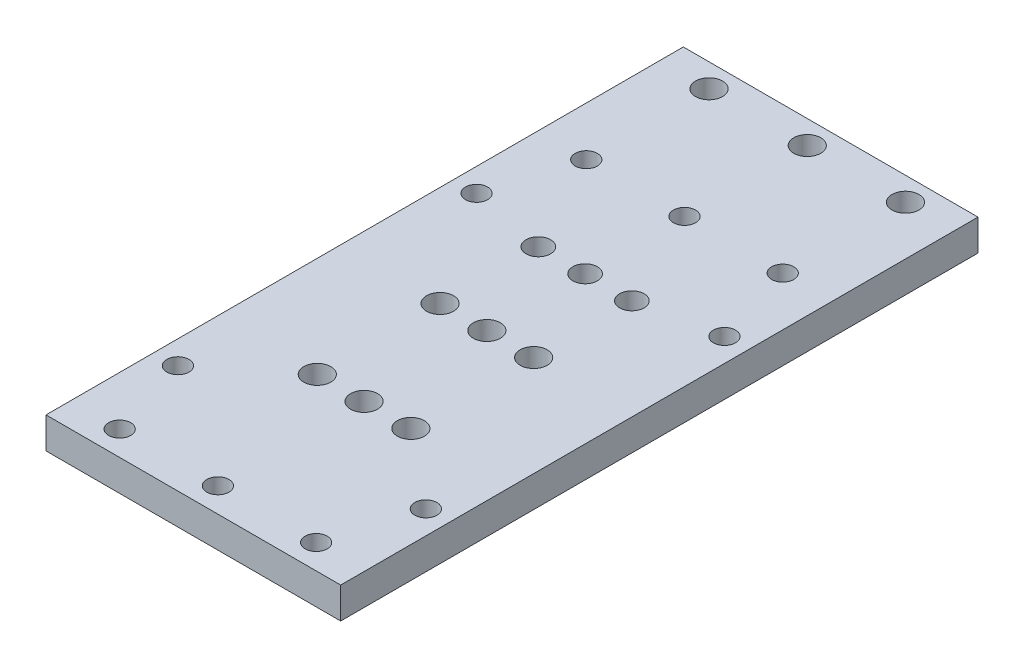
ISO-10303-21;
HEADER;
FILE_DESCRIPTION(('STEP AP214'),'2;1');
FILE_NAME('part.step','',(''),(''),'','','');
FILE_SCHEMA(('AUTOMOTIVE_DESIGN { 1 0 10303 214 1 1 1 1 }'));
ENDSEC;
DATA;
#1=APPLICATION_CONTEXT('core data for automotive mechanical design processes');
#2=APPLICATION_PROTOCOL_DEFINITION('international standard','automotive_design',2000,#1);
#3=PRODUCT_CONTEXT('',#1,'mechanical');
#4=PRODUCT('Part','Part','',(#3));
#5=PRODUCT_RELATED_PRODUCT_CATEGORY('part','',(#4));
#6=PRODUCT_DEFINITION_FORMATION('','',#4);
#7=PRODUCT_DEFINITION_CONTEXT('part definition',#1,'design');
#8=PRODUCT_DEFINITION('design','',#6,#7);
#9=PRODUCT_DEFINITION_SHAPE('','',#8);
#10=(LENGTH_UNIT() NAMED_UNIT(*) SI_UNIT(.MILLI.,.METRE.));
#11=(NAMED_UNIT(*) PLANE_ANGLE_UNIT() SI_UNIT($,.RADIAN.));
#12=(NAMED_UNIT(*) SI_UNIT($,.STERADIAN.) SOLID_ANGLE_UNIT());
#13=UNCERTAINTY_MEASURE_WITH_UNIT(LENGTH_MEASURE(1.E-05),#10,'distance_accuracy_value','');
#14=(GEOMETRIC_REPRESENTATION_CONTEXT(3) GLOBAL_UNCERTAINTY_ASSIGNED_CONTEXT((#13)) GLOBAL_UNIT_ASSIGNED_CONTEXT((#10,
#11,#12)) REPRESENTATION_CONTEXT('',''));
#15=CARTESIAN_POINT('',(0.,0.,0.));
#16=DIRECTION('',(0.,0.,1.));
#17=DIRECTION('',(1.,0.,0.));
#18=AXIS2_PLACEMENT_3D('',#15,#16,#17);
#19=CARTESIAN_POINT('',(30.,3.175,-80.));
#20=DIRECTION('',(-1.,0.,0.));
#21=DIRECTION('',(0.,0.,1.));
#22=AXIS2_PLACEMENT_3D('',#19,#20,#21);
#23=PLANE('',#22);
#24=DIRECTION('',(0.,0.,-1.));
#25=VECTOR('',#24,1.);
#26=CARTESIAN_POINT('',(30.,3.175,-80.));
#27=LINE('',#26,#25);
#28=CARTESIAN_POINT('',(30.,3.175,49.7625));
#29=VERTEX_POINT('',#28);
#30=CARTESIAN_POINT('',(30.,3.175,-80.));
#31=VERTEX_POINT('',#30);
#32=EDGE_CURVE('E85',#29,#31,#27,.T.);
#33=ORIENTED_EDGE('',*,*,#32,.F.);
#34=DIRECTION('',(0.,1.,0.));
#35=VECTOR('',#34,1.);
#36=CARTESIAN_POINT('',(30.,-70.3635883632779,49.7625));
#37=LINE('',#36,#35);
#38=CARTESIAN_POINT('',(30.,-3.175,49.7625));
#39=VERTEX_POINT('',#38);
#40=EDGE_CURVE('E236',#39,#29,#37,.T.);
#41=ORIENTED_EDGE('',*,*,#40,.F.);
#42=DIRECTION('',(0.,0.,-1.));
#43=VECTOR('',#42,1.);
#44=CARTESIAN_POINT('',(30.,-3.175,-80.));
#45=LINE('',#44,#43);
#46=CARTESIAN_POINT('',(30.,-3.175,-80.));
#47=VERTEX_POINT('',#46);
#48=EDGE_CURVE('E77',#39,#47,#45,.T.);
#49=ORIENTED_EDGE('',*,*,#48,.T.);
#50=DIRECTION('',(0.,-1.,0.));
#51=VECTOR('',#50,1.);
#52=CARTESIAN_POINT('',(30.,3.175,-80.));
#53=LINE('',#52,#51);
#54=EDGE_CURVE('E11',#31,#47,#53,.T.);
#55=ORIENTED_EDGE('',*,*,#54,.F.);
#56=EDGE_LOOP('',(#33,#41,#49,#55));
#57=FACE_BOUND('',#56,.T.);
#58=ADVANCED_FACE('F33',(#57),#23,.F.);
#59=CARTESIAN_POINT('',(-30.,3.175,-80.));
#60=DIRECTION('',(0.,0.,1.));
#61=DIRECTION('',(1.,0.,0.));
#62=AXIS2_PLACEMENT_3D('',#59,#60,#61);
#63=PLANE('',#62);
#64=CARTESIAN_POINT('',(12.,0.,-80.));
#65=DIRECTION('',(0.,0.,-1.));
#66=DIRECTION('',(-1.,0.,0.));
#67=AXIS2_PLACEMENT_3D('',#64,#65,#66);
#68=CIRCLE('',#67,1.5);
#69=CARTESIAN_POINT('',(10.5,0.,-80.));
#70=VERTEX_POINT('',#69);
#71=EDGE_CURVE('E154',#70,#70,#68,.T.);
#72=ORIENTED_EDGE('',*,*,#71,.F.);
#73=EDGE_LOOP('',(#72));
#74=FACE_BOUND('',#73,.T.);
#75=CARTESIAN_POINT('',(-12.,0.,-80.));
#76=DIRECTION('',(0.,0.,-1.));
#77=DIRECTION('',(1.,0.,0.));
#78=AXIS2_PLACEMENT_3D('',#75,#76,#77);
#79=CIRCLE('',#78,1.5);
#80=CARTESIAN_POINT('',(-10.5,0.,-80.));
#81=VERTEX_POINT('',#80);
#82=EDGE_CURVE('E147',#81,#81,#79,.T.);
#83=ORIENTED_EDGE('',*,*,#82,.F.);
#84=EDGE_LOOP('',(#83));
#85=FACE_BOUND('',#84,.T.);
#86=DIRECTION('',(-1.,0.,0.));
#87=VECTOR('',#86,1.);
#88=CARTESIAN_POINT('',(-30.,-3.175,-80.));
#89=LINE('',#88,#87);
#90=CARTESIAN_POINT('',(-30.,-3.175,-80.));
#91=VERTEX_POINT('',#90);
#92=EDGE_CURVE('E68',#47,#91,#89,.T.);
#93=ORIENTED_EDGE('',*,*,#92,.T.);
#94=DIRECTION('',(0.,-1.,0.));
#95=VECTOR('',#94,1.);
#96=CARTESIAN_POINT('',(-30.,3.175,-80.));
#97=LINE('',#96,#95);
#98=CARTESIAN_POINT('',(-30.,3.175,-80.));
#99=VERTEX_POINT('',#98);
#100=EDGE_CURVE('E40',#99,#91,#97,.T.);
#101=ORIENTED_EDGE('',*,*,#100,.F.);
#102=DIRECTION('',(-1.,0.,0.));
#103=VECTOR('',#102,1.);
#104=CARTESIAN_POINT('',(-30.,3.175,-80.));
#105=LINE('',#104,#103);
#106=EDGE_CURVE('E56',#31,#99,#105,.T.);
#107=ORIENTED_EDGE('',*,*,#106,.F.);
#108=ORIENTED_EDGE('',*,*,#54,.T.);
#109=EDGE_LOOP('',(#93,#101,#107,#108));
#110=FACE_BOUND('',#109,.T.);
#111=ADVANCED_FACE('F70',(#74,#85,#110),#63,.F.);
#112=CARTESIAN_POINT('',(-30.,3.175,-80.));
#113=DIRECTION('',(1.,0.,0.));
#114=DIRECTION('',(0.,0.,-1.));
#115=AXIS2_PLACEMENT_3D('',#112,#113,#114);
#116=PLANE('',#115);
#117=DIRECTION('',(0.,0.,1.));
#118=VECTOR('',#117,1.);
#119=CARTESIAN_POINT('',(-30.,-3.175,-80.));
#120=LINE('',#119,#118);
#121=CARTESIAN_POINT('',(-30.,-3.175,49.7625));
#122=VERTEX_POINT('',#121);
#123=EDGE_CURVE('E76',#91,#122,#120,.T.);
#124=ORIENTED_EDGE('',*,*,#123,.T.);
#125=DIRECTION('',(0.,1.,0.));
#126=VECTOR('',#125,1.);
#127=CARTESIAN_POINT('',(-30.,-70.3635883632779,49.7625));
#128=LINE('',#127,#126);
#129=CARTESIAN_POINT('',(-30.,3.175,49.7625));
#130=VERTEX_POINT('',#129);
#131=EDGE_CURVE('E47',#122,#130,#128,.T.);
#132=ORIENTED_EDGE('',*,*,#131,.T.);
#133=DIRECTION('',(0.,0.,1.));
#134=VECTOR('',#133,1.);
#135=CARTESIAN_POINT('',(-30.,3.175,-80.));
#136=LINE('',#135,#134);
#137=EDGE_CURVE('E82',#99,#130,#136,.T.);
#138=ORIENTED_EDGE('',*,*,#137,.F.);
#139=ORIENTED_EDGE('',*,*,#100,.T.);
#140=EDGE_LOOP('',(#124,#132,#138,#139));
#141=FACE_BOUND('',#140,.T.);
#142=ADVANCED_FACE('F81',(#141),#116,.F.);
#143=CARTESIAN_POINT('',(0.,3.175,0.));
#144=DIRECTION('',(0.,1.,0.));
#145=DIRECTION('',(0.,0.,1.));
#146=AXIS2_PLACEMENT_3D('',#143,#144,#145);
#147=PLANE('',#146);
#148=DIRECTION('',(-1.,0.,0.));
#149=VECTOR('',#148,1.);
#150=CARTESIAN_POINT('',(-30.,3.175,49.7625));
#151=LINE('',#150,#149);
#152=EDGE_CURVE('E239',#29,#130,#151,.T.);
#153=ORIENTED_EDGE('',*,*,#152,.F.);
#154=ORIENTED_EDGE('',*,*,#32,.T.);
#155=ORIENTED_EDGE('',*,*,#106,.T.);
#156=ORIENTED_EDGE('',*,*,#137,.T.);
#157=EDGE_LOOP('',(#153,#154,#155,#156));
#158=FACE_BOUND('',#157,.T.);
#159=CARTESIAN_POINT('',(-9.53,3.175,-9.99999999999993));
#160=DIRECTION('',(0.,1.,0.));
#161=DIRECTION('',(0.,0.,1.));
#162=AXIS2_PLACEMENT_3D('',#159,#160,#161);
#163=CIRCLE('',#162,2.75);
#164=CARTESIAN_POINT('',(-9.53,3.175,-7.24999999999993));
#165=VERTEX_POINT('',#164);
#166=EDGE_CURVE('E223',#165,#165,#163,.T.);
#167=ORIENTED_EDGE('',*,*,#166,.F.);
#168=EDGE_LOOP('',(#167));
#169=FACE_BOUND('',#168,.T.);
#170=CARTESIAN_POINT('',(9.53,3.175,15.));
#171=DIRECTION('',(0.,1.,0.));
#172=DIRECTION('',(0.,0.,1.));
#173=AXIS2_PLACEMENT_3D('',#170,#171,#172);
#174=CIRCLE('',#173,2.75);
#175=CARTESIAN_POINT('',(9.53,3.175,17.75));
#176=VERTEX_POINT('',#175);
#177=EDGE_CURVE('E222',#176,#176,#174,.T.);
#178=ORIENTED_EDGE('',*,*,#177,.F.);
#179=EDGE_LOOP('',(#178));
#180=FACE_BOUND('',#179,.T.);
#181=CARTESIAN_POINT('',(9.53,3.175,-10.));
#182=DIRECTION('',(0.,1.,0.));
#183=DIRECTION('',(0.,0.,1.));
#184=AXIS2_PLACEMENT_3D('',#181,#182,#183);
#185=CIRCLE('',#184,2.75);
#186=CARTESIAN_POINT('',(9.53,3.175,-7.25));
#187=VERTEX_POINT('',#186);
#188=EDGE_CURVE('E211',#187,#187,#185,.T.);
#189=ORIENTED_EDGE('',*,*,#188,.F.);
#190=EDGE_LOOP('',(#189));
#191=FACE_BOUND('',#190,.T.);
#192=CARTESIAN_POINT('',(0.,3.175,15.));
#193=DIRECTION('',(0.,1.,0.));
#194=DIRECTION('',(0.,0.,1.));
#195=AXIS2_PLACEMENT_3D('',#192,#193,#194);
#196=CIRCLE('',#195,2.75);
#197=CARTESIAN_POINT('',(0.,3.175,17.75));
#198=VERTEX_POINT('',#197);
#199=EDGE_CURVE('E210',#198,#198,#196,.T.);
#200=ORIENTED_EDGE('',*,*,#199,.F.);
#201=EDGE_LOOP('',(#200));
#202=FACE_BOUND('',#201,.T.);
#203=CARTESIAN_POINT('',(-9.52999999999999,3.175,15.0000000000001));
#204=DIRECTION('',(0.,1.,0.));
#205=DIRECTION('',(0.,0.,1.));
#206=AXIS2_PLACEMENT_3D('',#203,#204,#205);
#207=CIRCLE('',#206,2.75);
#208=CARTESIAN_POINT('',(-9.52999999999999,3.175,17.7500000000001));
#209=VERTEX_POINT('',#208);
#210=EDGE_CURVE('E233',#209,#209,#207,.T.);
#211=ORIENTED_EDGE('',*,*,#210,.F.);
#212=EDGE_LOOP('',(#211));
#213=FACE_BOUND('',#212,.T.);
#214=CARTESIAN_POINT('',(0.,3.175,-10.));
#215=DIRECTION('',(0.,1.,0.));
#216=DIRECTION('',(0.,0.,1.));
#217=AXIS2_PLACEMENT_3D('',#214,#215,#216);
#218=CIRCLE('',#217,2.75);
#219=CARTESIAN_POINT('',(0.,3.175,-7.25));
#220=VERTEX_POINT('',#219);
#221=EDGE_CURVE('E203',#220,#220,#218,.T.);
#222=ORIENTED_EDGE('',*,*,#221,.F.);
#223=EDGE_LOOP('',(#222));
#224=FACE_BOUND('',#223,.T.);
#225=CARTESIAN_POINT('',(-9.53,3.175,-29.9999999999999));
#226=DIRECTION('',(0.,1.,0.));
#227=DIRECTION('',(0.,0.,1.));
#228=AXIS2_PLACEMENT_3D('',#225,#226,#227);
#229=CIRCLE('',#228,2.5);
#230=CARTESIAN_POINT('',(-9.53,3.175,-27.4999999999999));
#231=VERTEX_POINT('',#230);
#232=EDGE_CURVE('E193',#231,#231,#229,.T.);
#233=ORIENTED_EDGE('',*,*,#232,.F.);
#234=EDGE_LOOP('',(#233));
#235=FACE_BOUND('',#234,.T.);
#236=CARTESIAN_POINT('',(9.53,3.175,-30.));
#237=DIRECTION('',(0.,1.,0.));
#238=DIRECTION('',(0.,0.,1.));
#239=AXIS2_PLACEMENT_3D('',#236,#237,#238);
#240=CIRCLE('',#239,2.5);
#241=CARTESIAN_POINT('',(9.53,3.175,-27.5));
#242=VERTEX_POINT('',#241);
#243=EDGE_CURVE('E192',#242,#242,#240,.T.);
#244=ORIENTED_EDGE('',*,*,#243,.F.);
#245=EDGE_LOOP('',(#244));
#246=FACE_BOUND('',#245,.T.);
#247=CARTESIAN_POINT('',(0.,3.175,-30.));
#248=DIRECTION('',(0.,1.,0.));
#249=DIRECTION('',(0.,0.,1.));
#250=AXIS2_PLACEMENT_3D('',#247,#248,#249);
#251=CIRCLE('',#250,2.5);
#252=CARTESIAN_POINT('',(0.,3.175,-27.5));
#253=VERTEX_POINT('',#252);
#254=EDGE_CURVE('E185',#253,#253,#251,.T.);
#255=ORIENTED_EDGE('',*,*,#254,.F.);
#256=EDGE_LOOP('',(#255));
#257=FACE_BOUND('',#256,.T.);
#258=CARTESIAN_POINT('',(-25.2375,3.175,-33.1375));
#259=DIRECTION('',(0.,1.,0.));
#260=DIRECTION('',(0.,0.,-1.));
#261=AXIS2_PLACEMENT_3D('',#258,#259,#260);
#262=CIRCLE('',#261,2.25);
#263=CARTESIAN_POINT('',(-25.2375,3.175,-35.3875));
#264=VERTEX_POINT('',#263);
#265=EDGE_CURVE('E169',#264,#264,#262,.T.);
#266=ORIENTED_EDGE('',*,*,#265,.F.);
#267=EDGE_LOOP('',(#266));
#268=FACE_BOUND('',#267,.T.);
#269=CARTESIAN_POINT('',(25.2375,3.175,-33.1375));
#270=DIRECTION('',(0.,1.,0.));
#271=DIRECTION('',(0.,0.,1.));
#272=AXIS2_PLACEMENT_3D('',#269,#270,#271);
#273=CIRCLE('',#272,2.25);
#274=CARTESIAN_POINT('',(25.2375,3.175,-30.8875));
#275=VERTEX_POINT('',#274);
#276=EDGE_CURVE('E168',#275,#275,#273,.T.);
#277=ORIENTED_EDGE('',*,*,#276,.F.);
#278=EDGE_LOOP('',(#277));
#279=FACE_BOUND('',#278,.T.);
#280=CARTESIAN_POINT('',(25.2375,3.175,27.6625));
#281=DIRECTION('',(0.,1.,0.));
#282=DIRECTION('',(0.,0.,-1.));
#283=AXIS2_PLACEMENT_3D('',#280,#281,#282);
#284=CIRCLE('',#283,2.25);
#285=CARTESIAN_POINT('',(25.2375,3.175,25.4125));
#286=VERTEX_POINT('',#285);
#287=EDGE_CURVE('E176',#286,#286,#284,.T.);
#288=ORIENTED_EDGE('',*,*,#287,.F.);
#289=EDGE_LOOP('',(#288));
#290=FACE_BOUND('',#289,.T.);
#291=CARTESIAN_POINT('',(-25.2375,3.175,27.6625));
#292=DIRECTION('',(0.,1.,0.));
#293=DIRECTION('',(0.,0.,1.));
#294=AXIS2_PLACEMENT_3D('',#291,#292,#293);
#295=CIRCLE('',#294,2.25);
#296=CARTESIAN_POINT('',(-25.2375,3.175,29.9125));
#297=VERTEX_POINT('',#296);
#298=EDGE_CURVE('E161',#297,#297,#295,.T.);
#299=ORIENTED_EDGE('',*,*,#298,.F.);
#300=EDGE_LOOP('',(#299));
#301=FACE_BOUND('',#300,.T.);
#302=CARTESIAN_POINT('',(20.,3.175,-50.2375));
#303=DIRECTION('',(0.,1.,0.));
#304=DIRECTION('',(0.,0.,1.));
#305=AXIS2_PLACEMENT_3D('',#302,#303,#304);
#306=CIRCLE('',#305,2.25);
#307=CARTESIAN_POINT('',(20.,3.175,-47.9875));
#308=VERTEX_POINT('',#307);
#309=EDGE_CURVE('E90',#308,#308,#306,.F.);
#310=ORIENTED_EDGE('',*,*,#309,.T.);
#311=EDGE_LOOP('',(#310));
#312=FACE_BOUND('',#311,.T.);
#313=CARTESIAN_POINT('',(-20.,3.175,-50.2375));
#314=DIRECTION('',(0.,1.,0.));
#315=DIRECTION('',(0.,0.,1.));
#316=AXIS2_PLACEMENT_3D('',#313,#314,#315);
#317=CIRCLE('',#316,2.25);
#318=CARTESIAN_POINT('',(-20.,3.175,-47.9875));
#319=VERTEX_POINT('',#318);
#320=EDGE_CURVE('E95',#319,#319,#317,.F.);
#321=ORIENTED_EDGE('',*,*,#320,.T.);
#322=EDGE_LOOP('',(#321));
#323=FACE_BOUND('',#322,.T.);
#324=CARTESIAN_POINT('',(20.,3.175,-75.2375));
#325=DIRECTION('',(0.,1.,0.));
#326=DIRECTION('',(0.,0.,1.));
#327=AXIS2_PLACEMENT_3D('',#324,#325,#326);
#328=CIRCLE('',#327,2.75);
#329=CARTESIAN_POINT('',(20.,3.175,-72.4875));
#330=VERTEX_POINT('',#329);
#331=EDGE_CURVE('E98',#330,#330,#328,.F.);
#332=ORIENTED_EDGE('',*,*,#331,.T.);
#333=EDGE_LOOP('',(#332));
#334=FACE_BOUND('',#333,.T.);
#335=CARTESIAN_POINT('',(-20.,3.175,-75.2375));
#336=DIRECTION('',(0.,1.,0.));
#337=DIRECTION('',(0.,0.,1.));
#338=AXIS2_PLACEMENT_3D('',#335,#336,#337);
#339=CIRCLE('',#338,2.75);
#340=CARTESIAN_POINT('',(-20.,3.175,-72.4875));
#341=VERTEX_POINT('',#340);
#342=EDGE_CURVE('E101',#341,#341,#339,.F.);
#343=ORIENTED_EDGE('',*,*,#342,.T.);
#344=EDGE_LOOP('',(#343));
#345=FACE_BOUND('',#344,.T.);
#346=CARTESIAN_POINT('',(2.33973929354467E-12,3.175,44.7625));
#347=DIRECTION('',(0.,1.,0.));
#348=DIRECTION('',(0.,0.,1.));
#349=AXIS2_PLACEMENT_3D('',#346,#347,#348);
#350=CIRCLE('',#349,2.25);
#351=CARTESIAN_POINT('',(2.33973929354467E-12,3.175,47.0125));
#352=VERTEX_POINT('',#351);
#353=EDGE_CURVE('E104',#352,#352,#350,.F.);
#354=ORIENTED_EDGE('',*,*,#353,.T.);
#355=EDGE_LOOP('',(#354));
#356=FACE_BOUND('',#355,.T.);
#357=CARTESIAN_POINT('',(-19.9999999999977,3.175,44.7625));
#358=DIRECTION('',(0.,1.,0.));
#359=DIRECTION('',(0.,0.,1.));
#360=AXIS2_PLACEMENT_3D('',#357,#358,#359);
#361=CIRCLE('',#360,2.25);
#362=CARTESIAN_POINT('',(-19.9999999999977,3.175,47.0125));
#363=VERTEX_POINT('',#362);
#364=EDGE_CURVE('E107',#363,#363,#361,.F.);
#365=ORIENTED_EDGE('',*,*,#364,.T.);
#366=EDGE_LOOP('',(#365));
#367=FACE_BOUND('',#366,.T.);
#368=CARTESIAN_POINT('',(20.0000000000023,3.175,44.7625));
#369=DIRECTION('',(0.,1.,0.));
#370=DIRECTION('',(0.,0.,1.));
#371=AXIS2_PLACEMENT_3D('',#368,#369,#370);
#372=CIRCLE('',#371,2.25);
#373=CARTESIAN_POINT('',(20.0000000000023,3.175,47.0125));
#374=VERTEX_POINT('',#373);
#375=EDGE_CURVE('E110',#374,#374,#372,.F.);
#376=ORIENTED_EDGE('',*,*,#375,.T.);
#377=EDGE_LOOP('',(#376));
#378=FACE_BOUND('',#377,.T.);
#379=CARTESIAN_POINT('',(0.,3.175,-50.2375));
#380=DIRECTION('',(0.,1.,0.));
#381=DIRECTION('',(0.,0.,1.));
#382=AXIS2_PLACEMENT_3D('',#379,#380,#381);
#383=CIRCLE('',#382,2.25);
#384=CARTESIAN_POINT('',(0.,3.175,-47.9875));
#385=VERTEX_POINT('',#384);
#386=EDGE_CURVE('E113',#385,#385,#383,.F.);
#387=ORIENTED_EDGE('',*,*,#386,.T.);
#388=EDGE_LOOP('',(#387));
#389=FACE_BOUND('',#388,.T.);
#390=CARTESIAN_POINT('',(0.,3.175,-75.2375));
#391=DIRECTION('',(0.,1.,0.));
#392=DIRECTION('',(0.,0.,1.));
#393=AXIS2_PLACEMENT_3D('',#390,#391,#392);
#394=CIRCLE('',#393,2.75);
#395=CARTESIAN_POINT('',(0.,3.175,-72.4875));
#396=VERTEX_POINT('',#395);
#397=EDGE_CURVE('E116',#396,#396,#394,.F.);
#398=ORIENTED_EDGE('',*,*,#397,.T.);
#399=EDGE_LOOP('',(#398));
#400=FACE_BOUND('',#399,.T.);
#401=ADVANCED_FACE('F250',(#158,#169,#180,#191,#202,#213,#224,#235,#246,#257,#268,#279,#290,
#301,#312,#323,#334,#345,#356,#367,#378,#389,#400),#147,.T.);
#402=CARTESIAN_POINT('',(0.,-3.175,0.));
#403=DIRECTION('',(0.,1.,0.));
#404=DIRECTION('',(0.,0.,1.));
#405=AXIS2_PLACEMENT_3D('',#402,#403,#404);
#406=PLANE('',#405);
#407=CARTESIAN_POINT('',(-9.53,-3.175,-9.99999999999993));
#408=DIRECTION('',(0.,1.,0.));
#409=DIRECTION('',(0.,0.,1.));
#410=AXIS2_PLACEMENT_3D('',#407,#408,#409);
#411=CIRCLE('',#410,2.75);
#412=CARTESIAN_POINT('',(-9.53,-3.175,-7.24999999999993));
#413=VERTEX_POINT('',#412);
#414=EDGE_CURVE('E219',#413,#413,#411,.F.);
#415=ORIENTED_EDGE('',*,*,#414,.F.);
#416=EDGE_LOOP('',(#415));
#417=FACE_BOUND('',#416,.T.);
#418=CARTESIAN_POINT('',(9.53,-3.175,15.));
#419=DIRECTION('',(0.,1.,0.));
#420=DIRECTION('',(0.,0.,1.));
#421=AXIS2_PLACEMENT_3D('',#418,#419,#420);
#422=CIRCLE('',#421,2.75);
#423=CARTESIAN_POINT('',(9.53,-3.175,17.75));
#424=VERTEX_POINT('',#423);
#425=EDGE_CURVE('E214',#424,#424,#422,.F.);
#426=ORIENTED_EDGE('',*,*,#425,.F.);
#427=EDGE_LOOP('',(#426));
#428=FACE_BOUND('',#427,.T.);
#429=CARTESIAN_POINT('',(9.53,-3.175,-10.));
#430=DIRECTION('',(0.,1.,0.));
#431=DIRECTION('',(0.,0.,1.));
#432=AXIS2_PLACEMENT_3D('',#429,#430,#431);
#433=CIRCLE('',#432,2.75);
#434=CARTESIAN_POINT('',(9.53,-3.175,-7.25));
#435=VERTEX_POINT('',#434);
#436=EDGE_CURVE('E207',#435,#435,#433,.F.);
#437=ORIENTED_EDGE('',*,*,#436,.F.);
#438=EDGE_LOOP('',(#437));
#439=FACE_BOUND('',#438,.T.);
#440=CARTESIAN_POINT('',(0.,-3.175,15.));
#441=DIRECTION('',(0.,1.,0.));
#442=DIRECTION('',(0.,0.,1.));
#443=AXIS2_PLACEMENT_3D('',#440,#441,#442);
#444=CIRCLE('',#443,2.75);
#445=CARTESIAN_POINT('',(0.,-3.175,17.75));
#446=VERTEX_POINT('',#445);
#447=EDGE_CURVE('E206',#446,#446,#444,.F.);
#448=ORIENTED_EDGE('',*,*,#447,.F.);
#449=EDGE_LOOP('',(#448));
#450=FACE_BOUND('',#449,.T.);
#451=CARTESIAN_POINT('',(-9.52999999999999,-3.175,15.0000000000001));
#452=DIRECTION('',(0.,1.,0.));
#453=DIRECTION('',(0.,0.,1.));
#454=AXIS2_PLACEMENT_3D('',#451,#452,#453);
#455=CIRCLE('',#454,2.75);
#456=CARTESIAN_POINT('',(-9.52999999999999,-3.175,17.7500000000001));
#457=VERTEX_POINT('',#456);
#458=EDGE_CURVE('E226',#457,#457,#455,.F.);
#459=ORIENTED_EDGE('',*,*,#458,.F.);
#460=EDGE_LOOP('',(#459));
#461=FACE_BOUND('',#460,.T.);
#462=CARTESIAN_POINT('',(0.,-3.175,-10.));
#463=DIRECTION('',(0.,1.,0.));
#464=DIRECTION('',(0.,0.,1.));
#465=AXIS2_PLACEMENT_3D('',#462,#463,#464);
#466=CIRCLE('',#465,2.75);
#467=CARTESIAN_POINT('',(0.,-3.175,-7.25));
#468=VERTEX_POINT('',#467);
#469=EDGE_CURVE('E196',#468,#468,#466,.F.);
#470=ORIENTED_EDGE('',*,*,#469,.F.);
#471=EDGE_LOOP('',(#470));
#472=FACE_BOUND('',#471,.T.);
#473=CARTESIAN_POINT('',(-9.53,-3.175,-29.9999999999999));
#474=DIRECTION('',(0.,1.,0.));
#475=DIRECTION('',(0.,0.,1.));
#476=AXIS2_PLACEMENT_3D('',#473,#474,#475);
#477=CIRCLE('',#476,2.5);
#478=CARTESIAN_POINT('',(-9.53,-3.175,-27.4999999999999));
#479=VERTEX_POINT('',#478);
#480=EDGE_CURVE('E189',#479,#479,#477,.F.);
#481=ORIENTED_EDGE('',*,*,#480,.F.);
#482=EDGE_LOOP('',(#481));
#483=FACE_BOUND('',#482,.T.);
#484=CARTESIAN_POINT('',(9.53,-3.175,-30.));
#485=DIRECTION('',(0.,1.,0.));
#486=DIRECTION('',(0.,0.,1.));
#487=AXIS2_PLACEMENT_3D('',#484,#485,#486);
#488=CIRCLE('',#487,2.5);
#489=CARTESIAN_POINT('',(9.53,-3.175,-27.5));
#490=VERTEX_POINT('',#489);
#491=EDGE_CURVE('E188',#490,#490,#488,.F.);
#492=ORIENTED_EDGE('',*,*,#491,.F.);
#493=EDGE_LOOP('',(#492));
#494=FACE_BOUND('',#493,.T.);
#495=CARTESIAN_POINT('',(0.,-3.175,-30.));
#496=DIRECTION('',(0.,1.,0.));
#497=DIRECTION('',(0.,0.,1.));
#498=AXIS2_PLACEMENT_3D('',#495,#496,#497);
#499=CIRCLE('',#498,2.5);
#500=CARTESIAN_POINT('',(0.,-3.175,-27.5));
#501=VERTEX_POINT('',#500);
#502=EDGE_CURVE('E172',#501,#501,#499,.F.);
#503=ORIENTED_EDGE('',*,*,#502,.F.);
#504=EDGE_LOOP('',(#503));
#505=FACE_BOUND('',#504,.T.);
#506=CARTESIAN_POINT('',(-25.2375,-3.175,-33.1375));
#507=DIRECTION('',(0.,1.,0.));
#508=DIRECTION('',(0.,0.,1.));
#509=AXIS2_PLACEMENT_3D('',#506,#507,#508);
#510=CIRCLE('',#509,2.25);
#511=CARTESIAN_POINT('',(-25.2375,-3.175,-30.8875));
#512=VERTEX_POINT('',#511);
#513=EDGE_CURVE('E165',#512,#512,#510,.F.);
#514=ORIENTED_EDGE('',*,*,#513,.F.);
#515=EDGE_LOOP('',(#514));
#516=FACE_BOUND('',#515,.T.);
#517=CARTESIAN_POINT('',(25.2375,-3.175,-33.1375));
#518=DIRECTION('',(0.,1.,0.));
#519=DIRECTION('',(0.,0.,1.));
#520=AXIS2_PLACEMENT_3D('',#517,#518,#519);
#521=CIRCLE('',#520,2.25);
#522=CARTESIAN_POINT('',(25.2375,-3.175,-30.8875));
#523=VERTEX_POINT('',#522);
#524=EDGE_CURVE('E173',#523,#523,#521,.F.);
#525=ORIENTED_EDGE('',*,*,#524,.F.);
#526=EDGE_LOOP('',(#525));
#527=FACE_BOUND('',#526,.T.);
#528=CARTESIAN_POINT('',(25.2375,-3.175,27.6625));
#529=DIRECTION('',(0.,1.,0.));
#530=DIRECTION('',(0.,0.,1.));
#531=AXIS2_PLACEMENT_3D('',#528,#529,#530);
#532=CIRCLE('',#531,2.25);
#533=CARTESIAN_POINT('',(25.2375,-3.175,29.9125));
#534=VERTEX_POINT('',#533);
#535=EDGE_CURVE('E164',#534,#534,#532,.F.);
#536=ORIENTED_EDGE('',*,*,#535,.F.);
#537=EDGE_LOOP('',(#536));
#538=FACE_BOUND('',#537,.T.);
#539=CARTESIAN_POINT('',(-25.2375,-3.175,27.6625));
#540=DIRECTION('',(0.,1.,0.));
#541=DIRECTION('',(0.,0.,1.));
#542=AXIS2_PLACEMENT_3D('',#539,#540,#541);
#543=CIRCLE('',#542,2.25);
#544=CARTESIAN_POINT('',(-25.2375,-3.175,29.9125));
#545=VERTEX_POINT('',#544);
#546=EDGE_CURVE('E151',#545,#545,#543,.F.);
#547=ORIENTED_EDGE('',*,*,#546,.F.);
#548=EDGE_LOOP('',(#547));
#549=FACE_BOUND('',#548,.T.);
#550=CARTESIAN_POINT('',(20.,-3.175,-50.2375));
#551=DIRECTION('',(0.,1.,0.));
#552=DIRECTION('',(0.,0.,1.));
#553=AXIS2_PLACEMENT_3D('',#550,#551,#552);
#554=CIRCLE('',#553,2.25);
#555=CARTESIAN_POINT('',(20.,-3.175,-47.9875));
#556=VERTEX_POINT('',#555);
#557=EDGE_CURVE('E122',#556,#556,#554,.F.);
#558=ORIENTED_EDGE('',*,*,#557,.F.);
#559=EDGE_LOOP('',(#558));
#560=FACE_BOUND('',#559,.T.);
#561=CARTESIAN_POINT('',(-20.,-3.175,-50.2375));
#562=DIRECTION('',(0.,1.,0.));
#563=DIRECTION('',(0.,0.,1.));
#564=AXIS2_PLACEMENT_3D('',#561,#562,#563);
#565=CIRCLE('',#564,2.25);
#566=CARTESIAN_POINT('',(-20.,-3.175,-47.9875));
#567=VERTEX_POINT('',#566);
#568=EDGE_CURVE('E130',#567,#567,#565,.F.);
#569=ORIENTED_EDGE('',*,*,#568,.F.);
#570=EDGE_LOOP('',(#569));
#571=FACE_BOUND('',#570,.T.);
#572=CARTESIAN_POINT('',(20.,-3.175,-75.2375));
#573=DIRECTION('',(0.,1.,0.));
#574=DIRECTION('',(0.,0.,1.));
#575=AXIS2_PLACEMENT_3D('',#572,#573,#574);
#576=CIRCLE('',#575,2.75);
#577=CARTESIAN_POINT('',(20.,-3.175,-72.4875));
#578=VERTEX_POINT('',#577);
#579=EDGE_CURVE('E126',#578,#578,#576,.F.);
#580=ORIENTED_EDGE('',*,*,#579,.F.);
#581=EDGE_LOOP('',(#580));
#582=FACE_BOUND('',#581,.T.);
#583=CARTESIAN_POINT('',(-20.,-3.175,-75.2375));
#584=DIRECTION('',(0.,1.,0.));
#585=DIRECTION('',(0.,0.,1.));
#586=AXIS2_PLACEMENT_3D('',#583,#584,#585);
#587=CIRCLE('',#586,2.75);
#588=CARTESIAN_POINT('',(-20.,-3.175,-72.4875));
#589=VERTEX_POINT('',#588);
#590=EDGE_CURVE('E123',#589,#589,#587,.F.);
#591=ORIENTED_EDGE('',*,*,#590,.F.);
#592=EDGE_LOOP('',(#591));
#593=FACE_BOUND('',#592,.T.);
#594=CARTESIAN_POINT('',(2.33973929354467E-12,-3.175,44.7625));
#595=DIRECTION('',(0.,1.,0.));
#596=DIRECTION('',(0.,0.,1.));
#597=AXIS2_PLACEMENT_3D('',#594,#595,#596);
#598=CIRCLE('',#597,2.25);
#599=CARTESIAN_POINT('',(2.33973929354467E-12,-3.175,47.0125));
#600=VERTEX_POINT('',#599);
#601=EDGE_CURVE('E141',#600,#600,#598,.F.);
#602=ORIENTED_EDGE('',*,*,#601,.F.);
#603=EDGE_LOOP('',(#602));
#604=FACE_BOUND('',#603,.T.);
#605=CARTESIAN_POINT('',(-19.9999999999977,-3.175,44.7625));
#606=DIRECTION('',(0.,1.,0.));
#607=DIRECTION('',(0.,0.,1.));
#608=AXIS2_PLACEMENT_3D('',#605,#606,#607);
#609=CIRCLE('',#608,2.25);
#610=CARTESIAN_POINT('',(-19.9999999999977,-3.175,47.0125));
#611=VERTEX_POINT('',#610);
#612=EDGE_CURVE('E138',#611,#611,#609,.F.);
#613=ORIENTED_EDGE('',*,*,#612,.F.);
#614=EDGE_LOOP('',(#613));
#615=FACE_BOUND('',#614,.T.);
#616=CARTESIAN_POINT('',(20.0000000000023,-3.175,44.7625));
#617=DIRECTION('',(0.,1.,0.));
#618=DIRECTION('',(0.,0.,1.));
#619=AXIS2_PLACEMENT_3D('',#616,#617,#618);
#620=CIRCLE('',#619,2.25);
#621=CARTESIAN_POINT('',(20.0000000000023,-3.175,47.0125));
#622=VERTEX_POINT('',#621);
#623=EDGE_CURVE('E135',#622,#622,#620,.F.);
#624=ORIENTED_EDGE('',*,*,#623,.F.);
#625=EDGE_LOOP('',(#624));
#626=FACE_BOUND('',#625,.T.);
#627=CARTESIAN_POINT('',(0.,-3.175,-50.2375));
#628=DIRECTION('',(0.,1.,0.));
#629=DIRECTION('',(0.,0.,1.));
#630=AXIS2_PLACEMENT_3D('',#627,#628,#629);
#631=CIRCLE('',#630,2.25);
#632=CARTESIAN_POINT('',(0.,-3.175,-47.9875));
#633=VERTEX_POINT('',#632);
#634=EDGE_CURVE('E127',#633,#633,#631,.F.);
#635=ORIENTED_EDGE('',*,*,#634,.F.);
#636=EDGE_LOOP('',(#635));
#637=FACE_BOUND('',#636,.T.);
#638=CARTESIAN_POINT('',(0.,-3.175,-75.2375));
#639=DIRECTION('',(0.,1.,0.));
#640=DIRECTION('',(0.,0.,1.));
#641=AXIS2_PLACEMENT_3D('',#638,#639,#640);
#642=CIRCLE('',#641,2.75);
#643=CARTESIAN_POINT('',(0.,-3.175,-72.4875));
#644=VERTEX_POINT('',#643);
#645=EDGE_CURVE('E119',#644,#644,#642,.F.);
#646=ORIENTED_EDGE('',*,*,#645,.F.);
#647=EDGE_LOOP('',(#646));
#648=FACE_BOUND('',#647,.T.);
#649=ORIENTED_EDGE('',*,*,#48,.F.);
#650=DIRECTION('',(1.,0.,0.));
#651=VECTOR('',#650,1.);
#652=CARTESIAN_POINT('',(-30.,-3.175,49.7625));
#653=LINE('',#652,#651);
#654=EDGE_CURVE('E84',#122,#39,#653,.T.);
#655=ORIENTED_EDGE('',*,*,#654,.F.);
#656=ORIENTED_EDGE('',*,*,#123,.F.);
#657=ORIENTED_EDGE('',*,*,#92,.F.);
#658=EDGE_LOOP('',(#649,#655,#656,#657));
#659=FACE_BOUND('',#658,.T.);
#660=ADVANCED_FACE('F83',(#417,#428,#439,#450,#461,#472,#483,#494,#505,#516,#527,#538,#549,#560,
#571,#582,#593,#604,#615,#626,#637,#648,#659),#406,.F.);
#661=CARTESIAN_POINT('',(0.,6.35,-75.2375));
#662=DIRECTION('',(0.,-1.,0.));
#663=DIRECTION('',(0.,0.,-1.));
#664=AXIS2_PLACEMENT_3D('',#661,#662,#663);
#665=CYLINDRICAL_SURFACE('',#664,2.75);
#666=ORIENTED_EDGE('',*,*,#397,.F.);
#667=EDGE_LOOP('',(#666));
#668=FACE_BOUND('',#667,.T.);
#669=ORIENTED_EDGE('',*,*,#645,.T.);
#670=EDGE_LOOP('',(#669));
#671=FACE_BOUND('',#670,.T.);
#672=ADVANCED_FACE('F299',(#668,#671),#665,.F.);
#673=CARTESIAN_POINT('',(0.,6.35,-50.2375));
#674=DIRECTION('',(0.,-1.,0.));
#675=DIRECTION('',(0.,0.,-1.));
#676=AXIS2_PLACEMENT_3D('',#673,#674,#675);
#677=CYLINDRICAL_SURFACE('',#676,2.25);
#678=ORIENTED_EDGE('',*,*,#386,.F.);
#679=EDGE_LOOP('',(#678));
#680=FACE_BOUND('',#679,.T.);
#681=ORIENTED_EDGE('',*,*,#634,.T.);
#682=EDGE_LOOP('',(#681));
#683=FACE_BOUND('',#682,.T.);
#684=ADVANCED_FACE('F302',(#680,#683),#677,.F.);
#685=CARTESIAN_POINT('',(20.0000000000023,6.35,44.7625));
#686=DIRECTION('',(0.,-1.,0.));
#687=DIRECTION('',(0.,0.,-1.));
#688=AXIS2_PLACEMENT_3D('',#685,#686,#687);
#689=CYLINDRICAL_SURFACE('',#688,2.25);
#690=ORIENTED_EDGE('',*,*,#375,.F.);
#691=EDGE_LOOP('',(#690));
#692=FACE_BOUND('',#691,.T.);
#693=ORIENTED_EDGE('',*,*,#623,.T.);
#694=EDGE_LOOP('',(#693));
#695=FACE_BOUND('',#694,.T.);
#696=ADVANCED_FACE('F349',(#692,#695),#689,.F.);
#697=CARTESIAN_POINT('',(-19.9999999999977,6.35,44.7625));
#698=DIRECTION('',(0.,-1.,0.));
#699=DIRECTION('',(0.,0.,-1.));
#700=AXIS2_PLACEMENT_3D('',#697,#698,#699);
#701=CYLINDRICAL_SURFACE('',#700,2.25);
#702=ORIENTED_EDGE('',*,*,#364,.F.);
#703=EDGE_LOOP('',(#702));
#704=FACE_BOUND('',#703,.T.);
#705=ORIENTED_EDGE('',*,*,#612,.T.);
#706=EDGE_LOOP('',(#705));
#707=FACE_BOUND('',#706,.T.);
#708=ADVANCED_FACE('F345',(#704,#707),#701,.F.);
#709=CARTESIAN_POINT('',(2.33973929354467E-12,6.35,44.7625));
#710=DIRECTION('',(0.,-1.,0.));
#711=DIRECTION('',(0.,0.,-1.));
#712=AXIS2_PLACEMENT_3D('',#709,#710,#711);
#713=CYLINDRICAL_SURFACE('',#712,2.25);
#714=ORIENTED_EDGE('',*,*,#353,.F.);
#715=EDGE_LOOP('',(#714));
#716=FACE_BOUND('',#715,.T.);
#717=ORIENTED_EDGE('',*,*,#601,.T.);
#718=EDGE_LOOP('',(#717));
#719=FACE_BOUND('',#718,.T.);
#720=ADVANCED_FACE('F348',(#716,#719),#713,.F.);
#721=CARTESIAN_POINT('',(-20.,6.35,-75.2375));
#722=DIRECTION('',(0.,-1.,0.));
#723=DIRECTION('',(0.,0.,-1.));
#724=AXIS2_PLACEMENT_3D('',#721,#722,#723);
#725=CYLINDRICAL_SURFACE('',#724,2.75);
#726=ORIENTED_EDGE('',*,*,#342,.F.);
#727=EDGE_LOOP('',(#726));
#728=FACE_BOUND('',#727,.T.);
#729=ORIENTED_EDGE('',*,*,#590,.T.);
#730=EDGE_LOOP('',(#729));
#731=FACE_BOUND('',#730,.T.);
#732=ADVANCED_FACE('F353',(#728,#731),#725,.F.);
#733=CARTESIAN_POINT('',(20.,6.35,-75.2375));
#734=DIRECTION('',(0.,-1.,0.));
#735=DIRECTION('',(0.,0.,-1.));
#736=AXIS2_PLACEMENT_3D('',#733,#734,#735);
#737=CYLINDRICAL_SURFACE('',#736,2.75);
#738=ORIENTED_EDGE('',*,*,#331,.F.);
#739=EDGE_LOOP('',(#738));
#740=FACE_BOUND('',#739,.T.);
#741=ORIENTED_EDGE('',*,*,#579,.T.);
#742=EDGE_LOOP('',(#741));
#743=FACE_BOUND('',#742,.T.);
#744=ADVANCED_FACE('F363',(#740,#743),#737,.F.);
#745=CARTESIAN_POINT('',(-20.,6.35,-50.2375));
#746=DIRECTION('',(0.,-1.,0.));
#747=DIRECTION('',(0.,0.,-1.));
#748=AXIS2_PLACEMENT_3D('',#745,#746,#747);
#749=CYLINDRICAL_SURFACE('',#748,2.25);
#750=ORIENTED_EDGE('',*,*,#320,.F.);
#751=EDGE_LOOP('',(#750));
#752=FACE_BOUND('',#751,.T.);
#753=ORIENTED_EDGE('',*,*,#568,.T.);
#754=EDGE_LOOP('',(#753));
#755=FACE_BOUND('',#754,.T.);
#756=ADVANCED_FACE('F339',(#752,#755),#749,.F.);
#757=CARTESIAN_POINT('',(20.,6.35,-50.2375));
#758=DIRECTION('',(0.,-1.,0.));
#759=DIRECTION('',(0.,0.,-1.));
#760=AXIS2_PLACEMENT_3D('',#757,#758,#759);
#761=CYLINDRICAL_SURFACE('',#760,2.25);
#762=ORIENTED_EDGE('',*,*,#309,.F.);
#763=EDGE_LOOP('',(#762));
#764=FACE_BOUND('',#763,.T.);
#765=ORIENTED_EDGE('',*,*,#557,.T.);
#766=EDGE_LOOP('',(#765));
#767=FACE_BOUND('',#766,.T.);
#768=ADVANCED_FACE('F329',(#764,#767),#761,.F.);
#769=CARTESIAN_POINT('',(-12.,0.,-72.));
#770=DIRECTION('',(0.,0.,-1.));
#771=DIRECTION('',(-1.,0.,0.));
#772=AXIS2_PLACEMENT_3D('',#769,#770,#771);
#773=CYLINDRICAL_SURFACE('',#772,1.5);
#774=CARTESIAN_POINT('',(-12.,0.,-72.));
#775=DIRECTION('',(0.,0.,-1.));
#776=DIRECTION('',(1.,0.,0.));
#777=AXIS2_PLACEMENT_3D('',#774,#775,#776);
#778=CIRCLE('',#777,1.5);
#779=CARTESIAN_POINT('',(-10.5,0.,-72.));
#780=VERTEX_POINT('',#779);
#781=EDGE_CURVE('E150',#780,#780,#778,.T.);
#782=ORIENTED_EDGE('',*,*,#781,.F.);
#783=EDGE_LOOP('',(#782));
#784=FACE_BOUND('',#783,.T.);
#785=ORIENTED_EDGE('',*,*,#82,.T.);
#786=EDGE_LOOP('',(#785));
#787=FACE_BOUND('',#786,.T.);
#788=ADVANCED_FACE('F326',(#784,#787),#773,.F.);
#789=CARTESIAN_POINT('',(-12.,0.,-72.));
#790=DIRECTION('',(0.,0.,1.));
#791=DIRECTION('',(1.,0.,0.));
#792=AXIS2_PLACEMENT_3D('',#789,#790,#791);
#793=PLANE('',#792);
#794=ORIENTED_EDGE('',*,*,#781,.T.);
#795=EDGE_LOOP('',(#794));
#796=FACE_BOUND('',#795,.T.);
#797=ADVANCED_FACE('F328',(#796),#793,.F.);
#798=CARTESIAN_POINT('',(12.,0.,-72.));
#799=DIRECTION('',(0.,0.,-1.));
#800=DIRECTION('',(-1.,0.,0.));
#801=AXIS2_PLACEMENT_3D('',#798,#799,#800);
#802=CYLINDRICAL_SURFACE('',#801,1.5);
#803=CARTESIAN_POINT('',(12.,0.,-72.));
#804=DIRECTION('',(0.,0.,-1.));
#805=DIRECTION('',(-1.,0.,0.));
#806=AXIS2_PLACEMENT_3D('',#803,#804,#805);
#807=CIRCLE('',#806,1.5);
#808=CARTESIAN_POINT('',(10.5,0.,-72.));
#809=VERTEX_POINT('',#808);
#810=EDGE_CURVE('E144',#809,#809,#807,.T.);
#811=ORIENTED_EDGE('',*,*,#810,.F.);
#812=EDGE_LOOP('',(#811));
#813=FACE_BOUND('',#812,.T.);
#814=ORIENTED_EDGE('',*,*,#71,.T.);
#815=EDGE_LOOP('',(#814));
#816=FACE_BOUND('',#815,.T.);
#817=ADVANCED_FACE('F336',(#813,#816),#802,.F.);
#818=CARTESIAN_POINT('',(12.,0.,-72.));
#819=DIRECTION('',(0.,0.,-1.));
#820=DIRECTION('',(-1.,0.,0.));
#821=AXIS2_PLACEMENT_3D('',#818,#819,#820);
#822=PLANE('',#821);
#823=ORIENTED_EDGE('',*,*,#810,.T.);
#824=EDGE_LOOP('',(#823));
#825=FACE_BOUND('',#824,.T.);
#826=ADVANCED_FACE('F426',(#825),#822,.T.);
#827=CARTESIAN_POINT('',(-25.2375,-9.53896103067893,27.6625));
#828=DIRECTION('',(0.,1.,0.));
#829=DIRECTION('',(0.,0.,1.));
#830=AXIS2_PLACEMENT_3D('',#827,#828,#829);
#831=CYLINDRICAL_SURFACE('',#830,2.25);
#832=ORIENTED_EDGE('',*,*,#546,.T.);
#833=EDGE_LOOP('',(#832));
#834=FACE_BOUND('',#833,.T.);
#835=ORIENTED_EDGE('',*,*,#298,.T.);
#836=EDGE_LOOP('',(#835));
#837=FACE_BOUND('',#836,.T.);
#838=ADVANCED_FACE('F435',(#834,#837),#831,.F.);
#839=CARTESIAN_POINT('',(25.2375,-9.53896103067893,27.6625));
#840=DIRECTION('',(0.,1.,0.));
#841=DIRECTION('',(0.,0.,1.));
#842=AXIS2_PLACEMENT_3D('',#839,#840,#841);
#843=CYLINDRICAL_SURFACE('',#842,2.25);
#844=ORIENTED_EDGE('',*,*,#535,.T.);
#845=EDGE_LOOP('',(#844));
#846=FACE_BOUND('',#845,.T.);
#847=ORIENTED_EDGE('',*,*,#287,.T.);
#848=EDGE_LOOP('',(#847));
#849=FACE_BOUND('',#848,.T.);
#850=ADVANCED_FACE('F445',(#846,#849),#843,.F.);
#851=CARTESIAN_POINT('',(25.2375,-9.53896103067893,-33.1375));
#852=DIRECTION('',(0.,1.,0.));
#853=DIRECTION('',(0.,0.,1.));
#854=AXIS2_PLACEMENT_3D('',#851,#852,#853);
#855=CYLINDRICAL_SURFACE('',#854,2.25);
#856=ORIENTED_EDGE('',*,*,#524,.T.);
#857=EDGE_LOOP('',(#856));
#858=FACE_BOUND('',#857,.T.);
#859=ORIENTED_EDGE('',*,*,#276,.T.);
#860=EDGE_LOOP('',(#859));
#861=FACE_BOUND('',#860,.T.);
#862=ADVANCED_FACE('F455',(#858,#861),#855,.F.);
#863=CARTESIAN_POINT('',(-25.2375,-9.53896103067893,-33.1375));
#864=DIRECTION('',(0.,1.,0.));
#865=DIRECTION('',(0.,0.,1.));
#866=AXIS2_PLACEMENT_3D('',#863,#864,#865);
#867=CYLINDRICAL_SURFACE('',#866,2.25);
#868=ORIENTED_EDGE('',*,*,#513,.T.);
#869=EDGE_LOOP('',(#868));
#870=FACE_BOUND('',#869,.T.);
#871=ORIENTED_EDGE('',*,*,#265,.T.);
#872=EDGE_LOOP('',(#871));
#873=FACE_BOUND('',#872,.T.);
#874=ADVANCED_FACE('F465',(#870,#873),#867,.F.);
#875=CARTESIAN_POINT('',(0.,-10.2460678118655,-30.));
#876=DIRECTION('',(0.,1.,0.));
#877=DIRECTION('',(0.,0.,1.));
#878=AXIS2_PLACEMENT_3D('',#875,#876,#877);
#879=CYLINDRICAL_SURFACE('',#878,2.5);
#880=ORIENTED_EDGE('',*,*,#502,.T.);
#881=EDGE_LOOP('',(#880));
#882=FACE_BOUND('',#881,.T.);
#883=ORIENTED_EDGE('',*,*,#254,.T.);
#884=EDGE_LOOP('',(#883));
#885=FACE_BOUND('',#884,.T.);
#886=ADVANCED_FACE('F475',(#882,#885),#879,.F.);
#887=CARTESIAN_POINT('',(9.53,-10.2460678118655,-30.));
#888=DIRECTION('',(0.,1.,0.));
#889=DIRECTION('',(0.,0.,1.));
#890=AXIS2_PLACEMENT_3D('',#887,#888,#889);
#891=CYLINDRICAL_SURFACE('',#890,2.5);
#892=ORIENTED_EDGE('',*,*,#491,.T.);
#893=EDGE_LOOP('',(#892));
#894=FACE_BOUND('',#893,.T.);
#895=ORIENTED_EDGE('',*,*,#243,.T.);
#896=EDGE_LOOP('',(#895));
#897=FACE_BOUND('',#896,.T.);
#898=ADVANCED_FACE('F485',(#894,#897),#891,.F.);
#899=CARTESIAN_POINT('',(-9.53,-10.2460678118655,-29.9999999999999));
#900=DIRECTION('',(0.,1.,0.));
#901=DIRECTION('',(0.,0.,1.));
#902=AXIS2_PLACEMENT_3D('',#899,#900,#901);
#903=CYLINDRICAL_SURFACE('',#902,2.5);
#904=ORIENTED_EDGE('',*,*,#480,.T.);
#905=EDGE_LOOP('',(#904));
#906=FACE_BOUND('',#905,.T.);
#907=ORIENTED_EDGE('',*,*,#232,.T.);
#908=EDGE_LOOP('',(#907));
#909=FACE_BOUND('',#908,.T.);
#910=ADVANCED_FACE('F495',(#906,#909),#903,.F.);
#911=CARTESIAN_POINT('',(0.,-10.953174593052,-10.));
#912=DIRECTION('',(0.,1.,0.));
#913=DIRECTION('',(0.,0.,1.));
#914=AXIS2_PLACEMENT_3D('',#911,#912,#913);
#915=CYLINDRICAL_SURFACE('',#914,2.75);
#916=ORIENTED_EDGE('',*,*,#469,.T.);
#917=EDGE_LOOP('',(#916));
#918=FACE_BOUND('',#917,.T.);
#919=ORIENTED_EDGE('',*,*,#221,.T.);
#920=EDGE_LOOP('',(#919));
#921=FACE_BOUND('',#920,.T.);
#922=ADVANCED_FACE('F505',(#918,#921),#915,.F.);
#923=CARTESIAN_POINT('',(-9.52999999999999,-10.953174593052,15.0000000000001));
#924=DIRECTION('',(0.,1.,0.));
#925=DIRECTION('',(0.,0.,1.));
#926=AXIS2_PLACEMENT_3D('',#923,#924,#925);
#927=CYLINDRICAL_SURFACE('',#926,2.75);
#928=ORIENTED_EDGE('',*,*,#458,.T.);
#929=EDGE_LOOP('',(#928));
#930=FACE_BOUND('',#929,.T.);
#931=ORIENTED_EDGE('',*,*,#210,.T.);
#932=EDGE_LOOP('',(#931));
#933=FACE_BOUND('',#932,.T.);
#934=ADVANCED_FACE('F515',(#930,#933),#927,.F.);
#935=CARTESIAN_POINT('',(0.,-10.953174593052,15.));
#936=DIRECTION('',(0.,1.,0.));
#937=DIRECTION('',(0.,0.,1.));
#938=AXIS2_PLACEMENT_3D('',#935,#936,#937);
#939=CYLINDRICAL_SURFACE('',#938,2.75);
#940=ORIENTED_EDGE('',*,*,#447,.T.);
#941=EDGE_LOOP('',(#940));
#942=FACE_BOUND('',#941,.T.);
#943=ORIENTED_EDGE('',*,*,#199,.T.);
#944=EDGE_LOOP('',(#943));
#945=FACE_BOUND('',#944,.T.);
#946=ADVANCED_FACE('F525',(#942,#945),#939,.F.);
#947=CARTESIAN_POINT('',(9.53,-10.953174593052,-10.));
#948=DIRECTION('',(0.,1.,0.));
#949=DIRECTION('',(0.,0.,1.));
#950=AXIS2_PLACEMENT_3D('',#947,#948,#949);
#951=CYLINDRICAL_SURFACE('',#950,2.75);
#952=ORIENTED_EDGE('',*,*,#436,.T.);
#953=EDGE_LOOP('',(#952));
#954=FACE_BOUND('',#953,.T.);
#955=ORIENTED_EDGE('',*,*,#188,.T.);
#956=EDGE_LOOP('',(#955));
#957=FACE_BOUND('',#956,.T.);
#958=ADVANCED_FACE('F535',(#954,#957),#951,.F.);
#959=CARTESIAN_POINT('',(9.53,-10.953174593052,15.));
#960=DIRECTION('',(0.,1.,0.));
#961=DIRECTION('',(0.,0.,1.));
#962=AXIS2_PLACEMENT_3D('',#959,#960,#961);
#963=CYLINDRICAL_SURFACE('',#962,2.75);
#964=ORIENTED_EDGE('',*,*,#425,.T.);
#965=EDGE_LOOP('',(#964));
#966=FACE_BOUND('',#965,.T.);
#967=ORIENTED_EDGE('',*,*,#177,.T.);
#968=EDGE_LOOP('',(#967));
#969=FACE_BOUND('',#968,.T.);
#970=ADVANCED_FACE('F545',(#966,#969),#963,.F.);
#971=CARTESIAN_POINT('',(-9.53,-10.953174593052,-9.99999999999993));
#972=DIRECTION('',(0.,1.,0.));
#973=DIRECTION('',(0.,0.,1.));
#974=AXIS2_PLACEMENT_3D('',#971,#972,#973);
#975=CYLINDRICAL_SURFACE('',#974,2.75);
#976=ORIENTED_EDGE('',*,*,#414,.T.);
#977=EDGE_LOOP('',(#976));
#978=FACE_BOUND('',#977,.T.);
#979=ORIENTED_EDGE('',*,*,#166,.T.);
#980=EDGE_LOOP('',(#979));
#981=FACE_BOUND('',#980,.T.);
#982=ADVANCED_FACE('F555',(#978,#981),#975,.F.);
#983=CARTESIAN_POINT('',(-30.,-70.3635883632779,49.7625));
#984=DIRECTION('',(0.,0.,-1.));
#985=DIRECTION('',(-1.,0.,0.));
#986=AXIS2_PLACEMENT_3D('',#983,#984,#985);
#987=PLANE('',#986);
#988=ORIENTED_EDGE('',*,*,#654,.T.);
#989=ORIENTED_EDGE('',*,*,#40,.T.);
#990=ORIENTED_EDGE('',*,*,#152,.T.);
#991=ORIENTED_EDGE('',*,*,#131,.F.);
#992=EDGE_LOOP('',(#988,#989,#990,#991));
#993=FACE_BOUND('',#992,.T.);
#994=ADVANCED_FACE('F243',(#993),#987,.F.);
#995=CLOSED_SHELL('',(#58,#111,#142,#401,#660,#672,#684,#696,#708,#720,#732,#744,#756,#768,#788,
#797,#817,#826,#838,#850,#862,#874,#886,#898,#910,#922,#934,#946,#958,#970,#982,#994));
#996=MANIFOLD_SOLID_BREP('B2',#995);
#997=ADVANCED_BREP_SHAPE_REPRESENTATION('',(#18,#996),#14);
#998=SHAPE_DEFINITION_REPRESENTATION(#9,#997);
ENDSEC;
END-ISO-10303-21;
